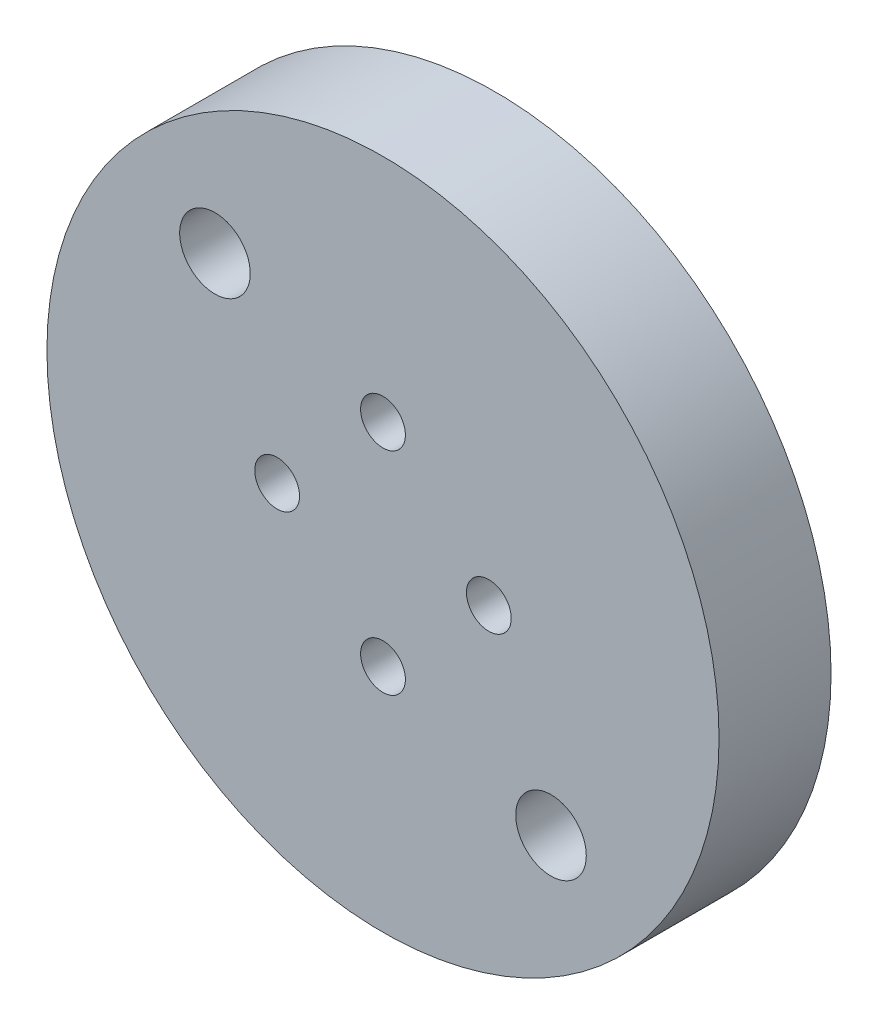
ISO-10303-21;
HEADER;
FILE_DESCRIPTION(('STEP AP214'),'2;1');
FILE_NAME('part.step','',(''),(''),'','','');
FILE_SCHEMA(('AUTOMOTIVE_DESIGN { 1 0 10303 214 1 1 1 1 }'));
ENDSEC;
DATA;
#1=APPLICATION_CONTEXT('core data for automotive mechanical design processes');
#2=APPLICATION_PROTOCOL_DEFINITION('international standard','automotive_design',2000,#1);
#3=PRODUCT_CONTEXT('',#1,'mechanical');
#4=PRODUCT('Part','Part','',(#3));
#5=PRODUCT_RELATED_PRODUCT_CATEGORY('part','',(#4));
#6=PRODUCT_DEFINITION_FORMATION('','',#4);
#7=PRODUCT_DEFINITION_CONTEXT('part definition',#1,'design');
#8=PRODUCT_DEFINITION('design','',#6,#7);
#9=PRODUCT_DEFINITION_SHAPE('','',#8);
#10=(LENGTH_UNIT() NAMED_UNIT(*) SI_UNIT(.MILLI.,.METRE.));
#11=(NAMED_UNIT(*) PLANE_ANGLE_UNIT() SI_UNIT($,.RADIAN.));
#12=(NAMED_UNIT(*) SI_UNIT($,.STERADIAN.) SOLID_ANGLE_UNIT());
#13=UNCERTAINTY_MEASURE_WITH_UNIT(LENGTH_MEASURE(1.E-05),#10,'distance_accuracy_value','');
#14=(GEOMETRIC_REPRESENTATION_CONTEXT(3) GLOBAL_UNCERTAINTY_ASSIGNED_CONTEXT((#13)) GLOBAL_UNIT_ASSIGNED_CONTEXT((#10,
#11,#12)) REPRESENTATION_CONTEXT('',''));
#15=CARTESIAN_POINT('',(0.,0.,0.));
#16=DIRECTION('',(0.,0.,1.));
#17=DIRECTION('',(1.,0.,0.));
#18=AXIS2_PLACEMENT_3D('',#15,#16,#17);
#19=CARTESIAN_POINT('',(0.,0.,12.7));
#20=DIRECTION('',(0.,0.,1.));
#21=DIRECTION('',(1.,0.,0.));
#22=AXIS2_PLACEMENT_3D('',#19,#20,#21);
#23=PLANE('',#22);
#24=CARTESIAN_POINT('',(-19.05,19.05,12.7));
#25=DIRECTION('',(0.,0.,1.));
#26=DIRECTION('',(1.,0.,0.));
#27=AXIS2_PLACEMENT_3D('',#24,#25,#26);
#28=CIRCLE('',#27,4.);
#29=CARTESIAN_POINT('',(-15.05,19.05,12.7));
#30=VERTEX_POINT('',#29);
#31=EDGE_CURVE('E79',#30,#30,#28,.T.);
#32=ORIENTED_EDGE('',*,*,#31,.F.);
#33=EDGE_LOOP('',(#32));
#34=FACE_BOUND('',#33,.T.);
#35=CARTESIAN_POINT('',(19.05,-19.05,12.7));
#36=DIRECTION('',(0.,0.,1.));
#37=DIRECTION('',(1.,0.,0.));
#38=AXIS2_PLACEMENT_3D('',#35,#36,#37);
#39=CIRCLE('',#38,4.);
#40=CARTESIAN_POINT('',(23.05,-19.05,12.7));
#41=VERTEX_POINT('',#40);
#42=EDGE_CURVE('E63',#41,#41,#39,.T.);
#43=ORIENTED_EDGE('',*,*,#42,.F.);
#44=EDGE_LOOP('',(#43));
#45=FACE_BOUND('',#44,.T.);
#46=CARTESIAN_POINT('',(-12.,0.,12.7));
#47=DIRECTION('',(0.,0.,1.));
#48=DIRECTION('',(1.,0.,0.));
#49=AXIS2_PLACEMENT_3D('',#46,#47,#48);
#50=CIRCLE('',#49,2.54);
#51=CARTESIAN_POINT('',(-9.46,0.,12.7));
#52=VERTEX_POINT('',#51);
#53=EDGE_CURVE('E92',#52,#52,#50,.T.);
#54=ORIENTED_EDGE('',*,*,#53,.F.);
#55=EDGE_LOOP('',(#54));
#56=FACE_BOUND('',#55,.T.);
#57=CARTESIAN_POINT('',(12.,0.,12.7));
#58=DIRECTION('',(0.,0.,1.));
#59=DIRECTION('',(1.,0.,0.));
#60=AXIS2_PLACEMENT_3D('',#57,#58,#59);
#61=CIRCLE('',#60,2.54);
#62=CARTESIAN_POINT('',(14.54,0.,12.7));
#63=VERTEX_POINT('',#62);
#64=EDGE_CURVE('E55',#63,#63,#61,.T.);
#65=ORIENTED_EDGE('',*,*,#64,.F.);
#66=EDGE_LOOP('',(#65));
#67=FACE_BOUND('',#66,.T.);
#68=CARTESIAN_POINT('',(0.,0.,12.7));
#69=DIRECTION('',(0.,0.,1.));
#70=DIRECTION('',(1.,0.,0.));
#71=AXIS2_PLACEMENT_3D('',#68,#69,#70);
#72=CIRCLE('',#71,38.1);
#73=CARTESIAN_POINT('',(38.1,0.,12.7));
#74=VERTEX_POINT('',#73);
#75=EDGE_CURVE('E10',#74,#74,#72,.T.);
#76=ORIENTED_EDGE('',*,*,#75,.T.);
#77=EDGE_LOOP('',(#76));
#78=FACE_BOUND('',#77,.T.);
#79=CARTESIAN_POINT('',(0.,-12.,12.7));
#80=DIRECTION('',(0.,0.,1.));
#81=DIRECTION('',(1.,0.,0.));
#82=AXIS2_PLACEMENT_3D('',#79,#80,#81);
#83=CIRCLE('',#82,2.54);
#84=CARTESIAN_POINT('',(2.54,-12.,12.7));
#85=VERTEX_POINT('',#84);
#86=EDGE_CURVE('E100',#85,#85,#83,.T.);
#87=ORIENTED_EDGE('',*,*,#86,.F.);
#88=EDGE_LOOP('',(#87));
#89=FACE_BOUND('',#88,.T.);
#90=CARTESIAN_POINT('',(0.,12.,12.7));
#91=DIRECTION('',(0.,0.,1.));
#92=DIRECTION('',(1.,0.,0.));
#93=AXIS2_PLACEMENT_3D('',#90,#91,#92);
#94=CIRCLE('',#93,2.54);
#95=CARTESIAN_POINT('',(2.54,12.,12.7));
#96=VERTEX_POINT('',#95);
#97=EDGE_CURVE('E84',#96,#96,#94,.T.);
#98=ORIENTED_EDGE('',*,*,#97,.F.);
#99=EDGE_LOOP('',(#98));
#100=FACE_BOUND('',#99,.T.);
#101=ADVANCED_FACE('F40',(#34,#45,#56,#67,#78,#89,#100),#23,.T.);
#102=CARTESIAN_POINT('',(0.,0.,0.));
#103=DIRECTION('',(0.,0.,1.));
#104=DIRECTION('',(1.,0.,0.));
#105=AXIS2_PLACEMENT_3D('',#102,#103,#104);
#106=PLANE('',#105);
#107=CARTESIAN_POINT('',(-19.05,19.05,0.));
#108=DIRECTION('',(0.,0.,1.));
#109=DIRECTION('',(1.,0.,0.));
#110=AXIS2_PLACEMENT_3D('',#107,#108,#109);
#111=CIRCLE('',#110,9.525);
#112=CARTESIAN_POINT('',(-9.525,19.05,0.));
#113=VERTEX_POINT('',#112);
#114=EDGE_CURVE('E190',#113,#113,#111,.T.);
#115=ORIENTED_EDGE('',*,*,#114,.T.);
#116=EDGE_LOOP('',(#115));
#117=FACE_BOUND('',#116,.T.);
#118=CARTESIAN_POINT('',(19.05,-19.05,0.));
#119=DIRECTION('',(0.,0.,1.));
#120=DIRECTION('',(1.,0.,0.));
#121=AXIS2_PLACEMENT_3D('',#118,#119,#120);
#122=CIRCLE('',#121,9.525);
#123=CARTESIAN_POINT('',(28.575,-19.05,0.));
#124=VERTEX_POINT('',#123);
#125=EDGE_CURVE('E73',#124,#124,#122,.T.);
#126=ORIENTED_EDGE('',*,*,#125,.T.);
#127=EDGE_LOOP('',(#126));
#128=FACE_BOUND('',#127,.T.);
#129=CARTESIAN_POINT('',(0.,0.,0.));
#130=DIRECTION('',(0.,0.,1.));
#131=DIRECTION('',(1.,0.,0.));
#132=AXIS2_PLACEMENT_3D('',#129,#130,#131);
#133=CIRCLE('',#132,38.1);
#134=CARTESIAN_POINT('',(38.1,0.,0.));
#135=VERTEX_POINT('',#134);
#136=EDGE_CURVE('E49',#135,#135,#133,.T.);
#137=ORIENTED_EDGE('',*,*,#136,.F.);
#138=EDGE_LOOP('',(#137));
#139=FACE_BOUND('',#138,.T.);
#140=CARTESIAN_POINT('',(12.,0.,0.));
#141=DIRECTION('',(0.,0.,1.));
#142=DIRECTION('',(1.,0.,0.));
#143=AXIS2_PLACEMENT_3D('',#140,#141,#142);
#144=CIRCLE('',#143,2.54);
#145=CARTESIAN_POINT('',(14.54,0.,0.));
#146=VERTEX_POINT('',#145);
#147=EDGE_CURVE('E58',#146,#146,#144,.T.);
#148=ORIENTED_EDGE('',*,*,#147,.T.);
#149=EDGE_LOOP('',(#148));
#150=FACE_BOUND('',#149,.T.);
#151=CARTESIAN_POINT('',(0.,-12.,0.));
#152=DIRECTION('',(0.,0.,1.));
#153=DIRECTION('',(1.,0.,0.));
#154=AXIS2_PLACEMENT_3D('',#151,#152,#153);
#155=CIRCLE('',#154,2.54);
#156=CARTESIAN_POINT('',(2.54,-12.,0.));
#157=VERTEX_POINT('',#156);
#158=EDGE_CURVE('E96',#157,#157,#155,.T.);
#159=ORIENTED_EDGE('',*,*,#158,.T.);
#160=EDGE_LOOP('',(#159));
#161=FACE_BOUND('',#160,.T.);
#162=CARTESIAN_POINT('',(-12.,0.,0.));
#163=DIRECTION('',(0.,0.,1.));
#164=DIRECTION('',(1.,0.,0.));
#165=AXIS2_PLACEMENT_3D('',#162,#163,#164);
#166=CIRCLE('',#165,2.54);
#167=CARTESIAN_POINT('',(-9.46,0.,0.));
#168=VERTEX_POINT('',#167);
#169=EDGE_CURVE('E88',#168,#168,#166,.T.);
#170=ORIENTED_EDGE('',*,*,#169,.T.);
#171=EDGE_LOOP('',(#170));
#172=FACE_BOUND('',#171,.T.);
#173=CARTESIAN_POINT('',(0.,12.,0.));
#174=DIRECTION('',(0.,0.,1.));
#175=DIRECTION('',(1.,0.,0.));
#176=AXIS2_PLACEMENT_3D('',#173,#174,#175);
#177=CIRCLE('',#176,2.54);
#178=CARTESIAN_POINT('',(2.54,12.,0.));
#179=VERTEX_POINT('',#178);
#180=EDGE_CURVE('E70',#179,#179,#177,.T.);
#181=ORIENTED_EDGE('',*,*,#180,.T.);
#182=EDGE_LOOP('',(#181));
#183=FACE_BOUND('',#182,.T.);
#184=ADVANCED_FACE('F114',(#117,#128,#139,#150,#161,#172,#183),#106,.F.);
#185=CARTESIAN_POINT('',(0.,0.,12.7));
#186=DIRECTION('',(0.,0.,-1.));
#187=DIRECTION('',(-1.,0.,0.));
#188=AXIS2_PLACEMENT_3D('',#185,#186,#187);
#189=CYLINDRICAL_SURFACE('',#188,38.1);
#190=ORIENTED_EDGE('',*,*,#75,.F.);
#191=EDGE_LOOP('',(#190));
#192=FACE_BOUND('',#191,.T.);
#193=ORIENTED_EDGE('',*,*,#136,.T.);
#194=EDGE_LOOP('',(#193));
#195=FACE_BOUND('',#194,.T.);
#196=ADVANCED_FACE('F42',(#192,#195),#189,.T.);
#197=CARTESIAN_POINT('',(12.,0.,12.7));
#198=DIRECTION('',(0.,0.,-1.));
#199=DIRECTION('',(-1.,0.,0.));
#200=AXIS2_PLACEMENT_3D('',#197,#198,#199);
#201=CYLINDRICAL_SURFACE('',#200,2.54);
#202=ORIENTED_EDGE('',*,*,#64,.T.);
#203=EDGE_LOOP('',(#202));
#204=FACE_BOUND('',#203,.T.);
#205=ORIENTED_EDGE('',*,*,#147,.F.);
#206=EDGE_LOOP('',(#205));
#207=FACE_BOUND('',#206,.T.);
#208=ADVANCED_FACE('F117',(#204,#207),#201,.F.);
#209=CARTESIAN_POINT('',(0.,-12.,12.7));
#210=DIRECTION('',(0.,0.,-1.));
#211=DIRECTION('',(-1.,0.,0.));
#212=AXIS2_PLACEMENT_3D('',#209,#210,#211);
#213=CYLINDRICAL_SURFACE('',#212,2.54);
#214=ORIENTED_EDGE('',*,*,#86,.T.);
#215=EDGE_LOOP('',(#214));
#216=FACE_BOUND('',#215,.T.);
#217=ORIENTED_EDGE('',*,*,#158,.F.);
#218=EDGE_LOOP('',(#217));
#219=FACE_BOUND('',#218,.T.);
#220=ADVANCED_FACE('F119',(#216,#219),#213,.F.);
#221=CARTESIAN_POINT('',(-12.,0.,12.7));
#222=DIRECTION('',(0.,0.,-1.));
#223=DIRECTION('',(-1.,0.,0.));
#224=AXIS2_PLACEMENT_3D('',#221,#222,#223);
#225=CYLINDRICAL_SURFACE('',#224,2.54);
#226=ORIENTED_EDGE('',*,*,#53,.T.);
#227=EDGE_LOOP('',(#226));
#228=FACE_BOUND('',#227,.T.);
#229=ORIENTED_EDGE('',*,*,#169,.F.);
#230=EDGE_LOOP('',(#229));
#231=FACE_BOUND('',#230,.T.);
#232=ADVANCED_FACE('F125',(#228,#231),#225,.F.);
#233=CARTESIAN_POINT('',(0.,12.,12.7));
#234=DIRECTION('',(0.,0.,-1.));
#235=DIRECTION('',(-1.,0.,0.));
#236=AXIS2_PLACEMENT_3D('',#233,#234,#235);
#237=CYLINDRICAL_SURFACE('',#236,2.54);
#238=ORIENTED_EDGE('',*,*,#97,.T.);
#239=EDGE_LOOP('',(#238));
#240=FACE_BOUND('',#239,.T.);
#241=ORIENTED_EDGE('',*,*,#180,.F.);
#242=EDGE_LOOP('',(#241));
#243=FACE_BOUND('',#242,.T.);
#244=ADVANCED_FACE('F148',(#240,#243),#237,.F.);
#245=CARTESIAN_POINT('',(19.05,-19.05,12.7));
#246=DIRECTION('',(0.,0.,-1.));
#247=DIRECTION('',(-1.,0.,0.));
#248=AXIS2_PLACEMENT_3D('',#245,#246,#247);
#249=CYLINDRICAL_SURFACE('',#248,4.);
#250=CARTESIAN_POINT('',(19.05,-19.05,6.35));
#251=DIRECTION('',(0.,0.,1.));
#252=DIRECTION('',(1.,0.,0.));
#253=AXIS2_PLACEMENT_3D('',#250,#251,#252);
#254=CIRCLE('',#253,4.);
#255=CARTESIAN_POINT('',(23.05,-19.05,6.35));
#256=VERTEX_POINT('',#255);
#257=EDGE_CURVE('E60',#256,#256,#254,.T.);
#258=ORIENTED_EDGE('',*,*,#257,.F.);
#259=EDGE_LOOP('',(#258));
#260=FACE_BOUND('',#259,.T.);
#261=ORIENTED_EDGE('',*,*,#42,.T.);
#262=EDGE_LOOP('',(#261));
#263=FACE_BOUND('',#262,.T.);
#264=ADVANCED_FACE('F151',(#260,#263),#249,.F.);
#265=CARTESIAN_POINT('',(19.05,-19.05,6.35));
#266=DIRECTION('',(0.,0.,-1.));
#267=DIRECTION('',(-1.,0.,0.));
#268=AXIS2_PLACEMENT_3D('',#265,#266,#267);
#269=CYLINDRICAL_SURFACE('',#268,9.525);
#270=CARTESIAN_POINT('',(19.05,-19.05,6.35));
#271=DIRECTION('',(0.,0.,1.));
#272=DIRECTION('',(1.,0.,0.));
#273=AXIS2_PLACEMENT_3D('',#270,#271,#272);
#274=CIRCLE('',#273,9.525);
#275=CARTESIAN_POINT('',(28.575,-19.05,6.35));
#276=VERTEX_POINT('',#275);
#277=EDGE_CURVE('E64',#276,#276,#274,.T.);
#278=ORIENTED_EDGE('',*,*,#277,.T.);
#279=EDGE_LOOP('',(#278));
#280=FACE_BOUND('',#279,.T.);
#281=ORIENTED_EDGE('',*,*,#125,.F.);
#282=EDGE_LOOP('',(#281));
#283=FACE_BOUND('',#282,.T.);
#284=ADVANCED_FACE('F159',(#280,#283),#269,.F.);
#285=CARTESIAN_POINT('',(19.05,-19.05,6.35));
#286=DIRECTION('',(0.,0.,1.));
#287=DIRECTION('',(1.,0.,0.));
#288=AXIS2_PLACEMENT_3D('',#285,#286,#287);
#289=PLANE('',#288);
#290=ORIENTED_EDGE('',*,*,#257,.T.);
#291=EDGE_LOOP('',(#290));
#292=FACE_BOUND('',#291,.T.);
#293=ORIENTED_EDGE('',*,*,#277,.F.);
#294=EDGE_LOOP('',(#293));
#295=FACE_BOUND('',#294,.T.);
#296=ADVANCED_FACE('F167',(#292,#295),#289,.F.);
#297=CARTESIAN_POINT('',(-19.05,19.05,12.7));
#298=DIRECTION('',(0.,0.,-1.));
#299=DIRECTION('',(-1.,0.,0.));
#300=AXIS2_PLACEMENT_3D('',#297,#298,#299);
#301=CYLINDRICAL_SURFACE('',#300,4.);
#302=CARTESIAN_POINT('',(-19.05,19.05,6.35));
#303=DIRECTION('',(0.,0.,1.));
#304=DIRECTION('',(1.,0.,0.));
#305=AXIS2_PLACEMENT_3D('',#302,#303,#304);
#306=CIRCLE('',#305,4.);
#307=CARTESIAN_POINT('',(-15.05,19.05,6.35));
#308=VERTEX_POINT('',#307);
#309=EDGE_CURVE('E44',#308,#308,#306,.T.);
#310=ORIENTED_EDGE('',*,*,#309,.F.);
#311=EDGE_LOOP('',(#310));
#312=FACE_BOUND('',#311,.T.);
#313=ORIENTED_EDGE('',*,*,#31,.T.);
#314=EDGE_LOOP('',(#313));
#315=FACE_BOUND('',#314,.T.);
#316=ADVANCED_FACE('F170',(#312,#315),#301,.F.);
#317=CARTESIAN_POINT('',(-19.05,19.05,6.35));
#318=DIRECTION('',(0.,0.,-1.));
#319=DIRECTION('',(-1.,0.,0.));
#320=AXIS2_PLACEMENT_3D('',#317,#318,#319);
#321=CYLINDRICAL_SURFACE('',#320,9.525);
#322=CARTESIAN_POINT('',(-19.05,19.05,6.35));
#323=DIRECTION('',(0.,0.,1.));
#324=DIRECTION('',(1.,0.,0.));
#325=AXIS2_PLACEMENT_3D('',#322,#323,#324);
#326=CIRCLE('',#325,9.525);
#327=CARTESIAN_POINT('',(-9.525,19.05,6.35));
#328=VERTEX_POINT('',#327);
#329=EDGE_CURVE('E188',#328,#328,#326,.T.);
#330=ORIENTED_EDGE('',*,*,#329,.T.);
#331=EDGE_LOOP('',(#330));
#332=FACE_BOUND('',#331,.T.);
#333=ORIENTED_EDGE('',*,*,#114,.F.);
#334=EDGE_LOOP('',(#333));
#335=FACE_BOUND('',#334,.T.);
#336=ADVANCED_FACE('F173',(#332,#335),#321,.F.);
#337=CARTESIAN_POINT('',(-19.05,19.05,6.35));
#338=DIRECTION('',(0.,0.,1.));
#339=DIRECTION('',(1.,0.,0.));
#340=AXIS2_PLACEMENT_3D('',#337,#338,#339);
#341=PLANE('',#340);
#342=ORIENTED_EDGE('',*,*,#309,.T.);
#343=EDGE_LOOP('',(#342));
#344=FACE_BOUND('',#343,.T.);
#345=ORIENTED_EDGE('',*,*,#329,.F.);
#346=EDGE_LOOP('',(#345));
#347=FACE_BOUND('',#346,.T.);
#348=ADVANCED_FACE('F177',(#344,#347),#341,.F.);
#349=CLOSED_SHELL('',(#101,#184,#196,#208,#220,#232,#244,#264,#284,#296,#316,#336,#348));
#350=MANIFOLD_SOLID_BREP('B2',#349);
#351=ADVANCED_BREP_SHAPE_REPRESENTATION('',(#18,#350),#14);
#352=SHAPE_DEFINITION_REPRESENTATION(#9,#351);
ENDSEC;
END-ISO-10303-21;
